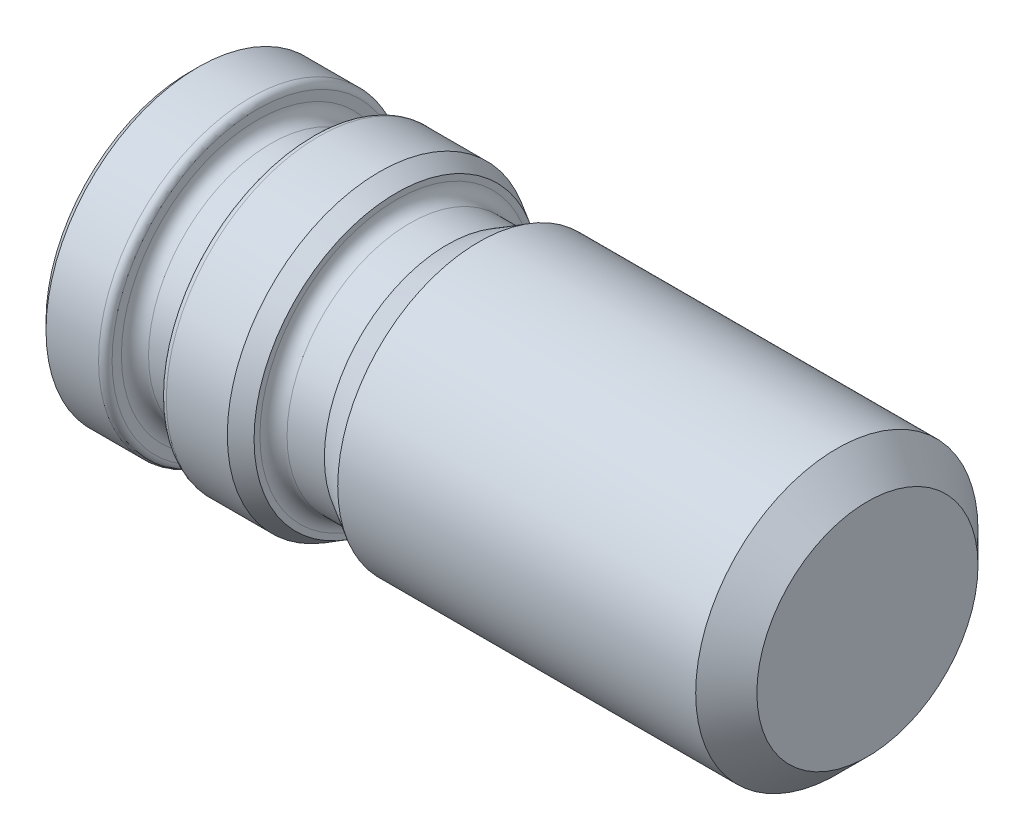
ISO-10303-21;
HEADER;
FILE_DESCRIPTION(('STEP AP214'),'2;1');
FILE_NAME('part.step','',(''),(''),'','','');
FILE_SCHEMA(('AUTOMOTIVE_DESIGN { 1 0 10303 214 1 1 1 1 }'));
ENDSEC;
DATA;
#1=APPLICATION_CONTEXT('core data for automotive mechanical design processes');
#2=APPLICATION_PROTOCOL_DEFINITION('international standard','automotive_design',2000,#1);
#3=PRODUCT_CONTEXT('',#1,'mechanical');
#4=PRODUCT('Part','Part','',(#3));
#5=PRODUCT_RELATED_PRODUCT_CATEGORY('part','',(#4));
#6=PRODUCT_DEFINITION_FORMATION('','',#4);
#7=PRODUCT_DEFINITION_CONTEXT('part definition',#1,'design');
#8=PRODUCT_DEFINITION('design','',#6,#7);
#9=PRODUCT_DEFINITION_SHAPE('','',#8);
#10=(LENGTH_UNIT() NAMED_UNIT(*) SI_UNIT(.MILLI.,.METRE.));
#11=(NAMED_UNIT(*) PLANE_ANGLE_UNIT() SI_UNIT($,.RADIAN.));
#12=(NAMED_UNIT(*) SI_UNIT($,.STERADIAN.) SOLID_ANGLE_UNIT());
#13=UNCERTAINTY_MEASURE_WITH_UNIT(LENGTH_MEASURE(1.E-05),#10,'distance_accuracy_value','');
#14=(GEOMETRIC_REPRESENTATION_CONTEXT(3) GLOBAL_UNCERTAINTY_ASSIGNED_CONTEXT((#13)) GLOBAL_UNIT_ASSIGNED_CONTEXT((#10,
#11,#12)) REPRESENTATION_CONTEXT('',''));
#15=CARTESIAN_POINT('',(0.,0.,0.));
#16=DIRECTION('',(0.,0.,1.));
#17=DIRECTION('',(1.,0.,0.));
#18=AXIS2_PLACEMENT_3D('',#15,#16,#17);
#19=CARTESIAN_POINT('',(-40.,8.975,0.));
#20=DIRECTION('',(1.,0.,0.));
#21=DIRECTION('',(0.,0.,-1.));
#22=AXIS2_PLACEMENT_3D('',#19,#20,#21);
#23=PLANE('',#22);
#24=CARTESIAN_POINT('',(-40.,0.,0.));
#25=DIRECTION('',(1.,0.,0.));
#26=DIRECTION('',(0.,0.,-1.));
#27=AXIS2_PLACEMENT_3D('',#24,#25,#26);
#28=CIRCLE('',#27,8.475);
#29=CARTESIAN_POINT('',(-40.,0.,-8.475));
#30=VERTEX_POINT('',#29);
#31=EDGE_CURVE('E229',#30,#30,#28,.F.);
#32=ORIENTED_EDGE('',*,*,#31,.T.);
#33=EDGE_LOOP('',(#32));
#34=FACE_BOUND('',#33,.T.);
#35=DIRECTION('',(0.,0.866025403784438,-0.5));
#36=VECTOR('',#35,1.);
#37=CARTESIAN_POINT('',(-40.,4.43124999999999,-7.87000585689109));
#38=LINE('',#37,#36);
#39=CARTESIAN_POINT('',(-40.,-4.6,-2.65581123827228));
#40=VERTEX_POINT('',#39);
#41=CARTESIAN_POINT('',(-40.,0.,-5.31162247654456));
#42=VERTEX_POINT('',#41);
#43=EDGE_CURVE('E216',#40,#42,#38,.T.);
#44=ORIENTED_EDGE('',*,*,#43,.T.);
#45=DIRECTION('',(0.,0.866025403784439,0.5));
#46=VECTOR('',#45,1.);
#47=CARTESIAN_POINT('',(-40.,9.03125,-0.097427857925748));
#48=LINE('',#47,#46);
#49=CARTESIAN_POINT('',(-40.,4.6,-2.65581123827228));
#50=VERTEX_POINT('',#49);
#51=EDGE_CURVE('E218',#42,#50,#48,.T.);
#52=ORIENTED_EDGE('',*,*,#51,.T.);
#53=DIRECTION('',(0.,0.,1.));
#54=VECTOR('',#53,1.);
#55=CARTESIAN_POINT('',(-40.,4.6,0.));
#56=LINE('',#55,#54);
#57=CARTESIAN_POINT('',(-40.,4.6,2.65581123827228));
#58=VERTEX_POINT('',#57);
#59=EDGE_CURVE('E208',#50,#58,#56,.T.);
#60=ORIENTED_EDGE('',*,*,#59,.T.);
#61=DIRECTION('',(0.,-0.866025403784439,0.5));
#62=VECTOR('',#61,1.);
#63=CARTESIAN_POINT('',(-40.,9.03125,0.0974278579257476));
#64=LINE('',#63,#62);
#65=CARTESIAN_POINT('',(-40.,0.,5.31162247654456));
#66=VERTEX_POINT('',#65);
#67=EDGE_CURVE('E210',#58,#66,#64,.T.);
#68=ORIENTED_EDGE('',*,*,#67,.T.);
#69=DIRECTION('',(0.,-0.866025403784439,-0.5));
#70=VECTOR('',#69,1.);
#71=CARTESIAN_POINT('',(-40.,4.43125,7.87000585689109));
#72=LINE('',#71,#70);
#73=CARTESIAN_POINT('',(-40.,-4.6,2.65581123827228));
#74=VERTEX_POINT('',#73);
#75=EDGE_CURVE('E212',#66,#74,#72,.T.);
#76=ORIENTED_EDGE('',*,*,#75,.T.);
#77=DIRECTION('',(0.,0.,-1.));
#78=VECTOR('',#77,1.);
#79=CARTESIAN_POINT('',(-40.,-4.6,0.));
#80=LINE('',#79,#78);
#81=EDGE_CURVE('E214',#74,#40,#80,.T.);
#82=ORIENTED_EDGE('',*,*,#81,.T.);
#83=EDGE_LOOP('',(#44,#52,#60,#68,#76,#82));
#84=FACE_BOUND('',#83,.T.);
#85=ADVANCED_FACE('F46',(#34,#84),#23,.F.);
#86=CARTESIAN_POINT('',(0.,0.,0.));
#87=DIRECTION('',(-1.,0.,0.));
#88=DIRECTION('',(0.,0.,1.));
#89=AXIS2_PLACEMENT_3D('',#86,#87,#88);
#90=CYLINDRICAL_SURFACE('',#89,8.975);
#91=CARTESIAN_POINT('',(-39.5,0.,0.));
#92=DIRECTION('',(1.,0.,0.));
#93=DIRECTION('',(0.,0.,-1.));
#94=AXIS2_PLACEMENT_3D('',#91,#92,#93);
#95=CIRCLE('',#94,8.975);
#96=CARTESIAN_POINT('',(-39.5,0.,-8.975));
#97=VERTEX_POINT('',#96);
#98=EDGE_CURVE('E244',#97,#97,#95,.T.);
#99=ORIENTED_EDGE('',*,*,#98,.T.);
#100=EDGE_LOOP('',(#99));
#101=FACE_BOUND('',#100,.T.);
#102=CARTESIAN_POINT('',(-36.4,0.,0.));
#103=DIRECTION('',(-1.,0.,0.));
#104=DIRECTION('',(0.,0.,1.));
#105=AXIS2_PLACEMENT_3D('',#102,#103,#104);
#106=CIRCLE('',#105,8.975);
#107=CARTESIAN_POINT('',(-36.4,0.,8.975));
#108=VERTEX_POINT('',#107);
#109=EDGE_CURVE('E202',#108,#108,#106,.T.);
#110=ORIENTED_EDGE('',*,*,#109,.T.);
#111=EDGE_LOOP('',(#110));
#112=FACE_BOUND('',#111,.T.);
#113=ADVANCED_FACE('F263',(#101,#112),#90,.T.);
#114=CARTESIAN_POINT('',(-36.4,0.,0.));
#115=DIRECTION('',(-1.,0.,0.));
#116=DIRECTION('',(0.,0.,1.));
#117=AXIS2_PLACEMENT_3D('',#114,#115,#116);
#118=TOROIDAL_SURFACE('',#117,8.575,0.399999999999998);
#119=ORIENTED_EDGE('',*,*,#109,.F.);
#120=EDGE_LOOP('',(#119));
#121=FACE_BOUND('',#120,.T.);
#122=CARTESIAN_POINT('',(-36.,0.,0.));
#123=DIRECTION('',(-1.,0.,0.));
#124=DIRECTION('',(0.,0.,1.));
#125=AXIS2_PLACEMENT_3D('',#122,#123,#124);
#126=CIRCLE('',#125,8.575);
#127=CARTESIAN_POINT('',(-36.,0.,8.575));
#128=VERTEX_POINT('',#127);
#129=EDGE_CURVE('E199',#128,#128,#126,.T.);
#130=ORIENTED_EDGE('',*,*,#129,.T.);
#131=EDGE_LOOP('',(#130));
#132=FACE_BOUND('',#131,.T.);
#133=ADVANCED_FACE('F270',(#121,#132),#118,.T.);
#134=CARTESIAN_POINT('',(-36.,8.025,0.));
#135=DIRECTION('',(-1.,0.,0.));
#136=DIRECTION('',(0.,0.,1.));
#137=AXIS2_PLACEMENT_3D('',#134,#135,#136);
#138=PLANE('',#137);
#139=ORIENTED_EDGE('',*,*,#129,.F.);
#140=EDGE_LOOP('',(#139));
#141=FACE_BOUND('',#140,.T.);
#142=CARTESIAN_POINT('',(-36.,0.,0.));
#143=DIRECTION('',(-1.,0.,0.));
#144=DIRECTION('',(0.,0.,1.));
#145=AXIS2_PLACEMENT_3D('',#142,#143,#144);
#146=CIRCLE('',#145,8.025);
#147=CARTESIAN_POINT('',(-36.,0.,8.025));
#148=VERTEX_POINT('',#147);
#149=EDGE_CURVE('E196',#148,#148,#146,.T.);
#150=ORIENTED_EDGE('',*,*,#149,.T.);
#151=EDGE_LOOP('',(#150));
#152=FACE_BOUND('',#151,.T.);
#153=ADVANCED_FACE('F387',(#141,#152),#138,.F.);
#154=CARTESIAN_POINT('',(-35.2,0.,0.));
#155=DIRECTION('',(-1.,0.,0.));
#156=DIRECTION('',(0.,0.,1.));
#157=AXIS2_PLACEMENT_3D('',#154,#155,#156);
#158=TOROIDAL_SURFACE('',#157,8.025,0.800000000000001);
#159=ORIENTED_EDGE('',*,*,#149,.F.);
#160=EDGE_LOOP('',(#159));
#161=FACE_BOUND('',#160,.T.);
#162=CARTESIAN_POINT('',(-35.2,0.,0.));
#163=DIRECTION('',(-1.,0.,0.));
#164=DIRECTION('',(0.,0.,1.));
#165=AXIS2_PLACEMENT_3D('',#162,#163,#164);
#166=CIRCLE('',#165,7.225);
#167=CARTESIAN_POINT('',(-35.2,0.,7.225));
#168=VERTEX_POINT('',#167);
#169=EDGE_CURVE('E193',#168,#168,#166,.T.);
#170=ORIENTED_EDGE('',*,*,#169,.T.);
#171=EDGE_LOOP('',(#170));
#172=FACE_BOUND('',#171,.T.);
#173=ADVANCED_FACE('F383',(#161,#172),#158,.F.);
#174=CARTESIAN_POINT('',(0.,0.,0.));
#175=DIRECTION('',(-1.,0.,0.));
#176=DIRECTION('',(0.,0.,1.));
#177=AXIS2_PLACEMENT_3D('',#174,#175,#176);
#178=CYLINDRICAL_SURFACE('',#177,7.225);
#179=ORIENTED_EDGE('',*,*,#169,.F.);
#180=EDGE_LOOP('',(#179));
#181=FACE_BOUND('',#180,.T.);
#182=CARTESIAN_POINT('',(-33.6,0.,0.));
#183=DIRECTION('',(-1.,0.,0.));
#184=DIRECTION('',(0.,0.,1.));
#185=AXIS2_PLACEMENT_3D('',#182,#183,#184);
#186=CIRCLE('',#185,7.225);
#187=CARTESIAN_POINT('',(-33.6,0.,7.225));
#188=VERTEX_POINT('',#187);
#189=EDGE_CURVE('E190',#188,#188,#186,.T.);
#190=ORIENTED_EDGE('',*,*,#189,.T.);
#191=EDGE_LOOP('',(#190));
#192=FACE_BOUND('',#191,.T.);
#193=ADVANCED_FACE('F379',(#181,#192),#178,.T.);
#194=CARTESIAN_POINT('',(-33.6,0.,0.));
#195=DIRECTION('',(-1.,0.,0.));
#196=DIRECTION('',(0.,0.,1.));
#197=AXIS2_PLACEMENT_3D('',#194,#195,#196);
#198=TOROIDAL_SURFACE('',#197,8.025,0.799999999999997);
#199=ORIENTED_EDGE('',*,*,#189,.F.);
#200=EDGE_LOOP('',(#199));
#201=FACE_BOUND('',#200,.T.);
#202=CARTESIAN_POINT('',(-32.8,0.,0.));
#203=DIRECTION('',(-1.,0.,0.));
#204=DIRECTION('',(0.,0.,1.));
#205=AXIS2_PLACEMENT_3D('',#202,#203,#204);
#206=CIRCLE('',#205,8.025);
#207=CARTESIAN_POINT('',(-32.8,0.,8.025));
#208=VERTEX_POINT('',#207);
#209=EDGE_CURVE('E187',#208,#208,#206,.T.);
#210=ORIENTED_EDGE('',*,*,#209,.T.);
#211=EDGE_LOOP('',(#210));
#212=FACE_BOUND('',#211,.T.);
#213=ADVANCED_FACE('F375',(#201,#212),#198,.F.);
#214=CARTESIAN_POINT('',(-32.8,8.575,0.));
#215=DIRECTION('',(1.,0.,0.));
#216=DIRECTION('',(0.,0.,-1.));
#217=AXIS2_PLACEMENT_3D('',#214,#215,#216);
#218=PLANE('',#217);
#219=ORIENTED_EDGE('',*,*,#209,.F.);
#220=EDGE_LOOP('',(#219));
#221=FACE_BOUND('',#220,.T.);
#222=CARTESIAN_POINT('',(-32.8,0.,0.));
#223=DIRECTION('',(-1.,0.,0.));
#224=DIRECTION('',(0.,0.,1.));
#225=AXIS2_PLACEMENT_3D('',#222,#223,#224);
#226=CIRCLE('',#225,8.575);
#227=CARTESIAN_POINT('',(-32.8,0.,8.575));
#228=VERTEX_POINT('',#227);
#229=EDGE_CURVE('E184',#228,#228,#226,.T.);
#230=ORIENTED_EDGE('',*,*,#229,.T.);
#231=EDGE_LOOP('',(#230));
#232=FACE_BOUND('',#231,.T.);
#233=ADVANCED_FACE('F371',(#221,#232),#218,.F.);
#234=CARTESIAN_POINT('',(-32.4,0.,0.));
#235=DIRECTION('',(-1.,0.,0.));
#236=DIRECTION('',(0.,0.,1.));
#237=AXIS2_PLACEMENT_3D('',#234,#235,#236);
#238=TOROIDAL_SURFACE('',#237,8.575,0.399999999999995);
#239=ORIENTED_EDGE('',*,*,#229,.F.);
#240=EDGE_LOOP('',(#239));
#241=FACE_BOUND('',#240,.T.);
#242=CARTESIAN_POINT('',(-32.4,0.,0.));
#243=DIRECTION('',(-1.,0.,0.));
#244=DIRECTION('',(0.,0.,1.));
#245=AXIS2_PLACEMENT_3D('',#242,#243,#244);
#246=CIRCLE('',#245,8.975);
#247=CARTESIAN_POINT('',(-32.4,0.,8.975));
#248=VERTEX_POINT('',#247);
#249=EDGE_CURVE('E181',#248,#248,#246,.T.);
#250=ORIENTED_EDGE('',*,*,#249,.T.);
#251=EDGE_LOOP('',(#250));
#252=FACE_BOUND('',#251,.T.);
#253=ADVANCED_FACE('F368',(#241,#252),#238,.T.);
#254=CARTESIAN_POINT('',(0.,0.,0.));
#255=DIRECTION('',(-1.,0.,0.));
#256=DIRECTION('',(0.,0.,1.));
#257=AXIS2_PLACEMENT_3D('',#254,#255,#256);
#258=CYLINDRICAL_SURFACE('',#257,8.975);
#259=CARTESIAN_POINT('',(-28.8,0.,0.));
#260=DIRECTION('',(-1.,0.,0.));
#261=DIRECTION('',(0.,0.,1.));
#262=AXIS2_PLACEMENT_3D('',#259,#260,#261);
#263=CIRCLE('',#262,8.975);
#264=CARTESIAN_POINT('',(-28.8,0.,8.975));
#265=VERTEX_POINT('',#264);
#266=EDGE_CURVE('E54',#265,#265,#263,.T.);
#267=ORIENTED_EDGE('',*,*,#266,.T.);
#268=EDGE_LOOP('',(#267));
#269=FACE_BOUND('',#268,.T.);
#270=ORIENTED_EDGE('',*,*,#249,.F.);
#271=EDGE_LOOP('',(#270));
#272=FACE_BOUND('',#271,.T.);
#273=ADVANCED_FACE('F249',(#269,#272),#258,.T.);
#274=CARTESIAN_POINT('',(-27.8,8.05,0.));
#275=DIRECTION('',(-1.,0.,0.));
#276=DIRECTION('',(0.,0.,1.));
#277=AXIS2_PLACEMENT_3D('',#274,#275,#276);
#278=PLANE('',#277);
#279=CARTESIAN_POINT('',(-27.8,0.,0.));
#280=DIRECTION('',(-1.,0.,0.));
#281=DIRECTION('',(0.,0.,1.));
#282=AXIS2_PLACEMENT_3D('',#279,#280,#281);
#283=CIRCLE('',#282,8.39764973081037);
#284=CARTESIAN_POINT('',(-27.8,0.,8.39764973081037));
#285=VERTEX_POINT('',#284);
#286=EDGE_CURVE('E11',#285,#285,#283,.F.);
#287=ORIENTED_EDGE('',*,*,#286,.T.);
#288=EDGE_LOOP('',(#287));
#289=FACE_BOUND('',#288,.T.);
#290=CARTESIAN_POINT('',(-27.8,0.,0.));
#291=DIRECTION('',(-1.,0.,0.));
#292=DIRECTION('',(0.,0.,1.));
#293=AXIS2_PLACEMENT_3D('',#290,#291,#292);
#294=CIRCLE('',#293,8.05);
#295=CARTESIAN_POINT('',(-27.8,0.,8.05));
#296=VERTEX_POINT('',#295);
#297=EDGE_CURVE('E178',#296,#296,#294,.T.);
#298=ORIENTED_EDGE('',*,*,#297,.T.);
#299=EDGE_LOOP('',(#298));
#300=FACE_BOUND('',#299,.T.);
#301=ADVANCED_FACE('F362',(#289,#300),#278,.F.);
#302=CARTESIAN_POINT('',(-27.,0.,0.));
#303=DIRECTION('',(-1.,0.,0.));
#304=DIRECTION('',(0.,0.,1.));
#305=AXIS2_PLACEMENT_3D('',#302,#303,#304);
#306=TOROIDAL_SURFACE('',#305,8.05,0.799999999999997);
#307=ORIENTED_EDGE('',*,*,#297,.F.);
#308=EDGE_LOOP('',(#307));
#309=FACE_BOUND('',#308,.T.);
#310=CARTESIAN_POINT('',(-27.,0.,0.));
#311=DIRECTION('',(-1.,0.,0.));
#312=DIRECTION('',(0.,0.,1.));
#313=AXIS2_PLACEMENT_3D('',#310,#311,#312);
#314=CIRCLE('',#313,7.25);
#315=CARTESIAN_POINT('',(-27.,0.,7.25));
#316=VERTEX_POINT('',#315);
#317=EDGE_CURVE('E175',#316,#316,#314,.T.);
#318=ORIENTED_EDGE('',*,*,#317,.T.);
#319=EDGE_LOOP('',(#318));
#320=FACE_BOUND('',#319,.T.);
#321=ADVANCED_FACE('F358',(#309,#320),#306,.F.);
#322=CARTESIAN_POINT('',(0.,0.,0.));
#323=DIRECTION('',(-1.,0.,0.));
#324=DIRECTION('',(0.,0.,1.));
#325=AXIS2_PLACEMENT_3D('',#322,#323,#324);
#326=CYLINDRICAL_SURFACE('',#325,7.25);
#327=ORIENTED_EDGE('',*,*,#317,.F.);
#328=EDGE_LOOP('',(#327));
#329=FACE_BOUND('',#328,.T.);
#330=CARTESIAN_POINT('',(-24.8,0.,0.));
#331=DIRECTION('',(-1.,0.,0.));
#332=DIRECTION('',(0.,0.,1.));
#333=AXIS2_PLACEMENT_3D('',#330,#331,#332);
#334=CIRCLE('',#333,7.25);
#335=CARTESIAN_POINT('',(-24.8,0.,7.25));
#336=VERTEX_POINT('',#335);
#337=EDGE_CURVE('E172',#336,#336,#334,.T.);
#338=ORIENTED_EDGE('',*,*,#337,.T.);
#339=EDGE_LOOP('',(#338));
#340=FACE_BOUND('',#339,.T.);
#341=ADVANCED_FACE('F354',(#329,#340),#326,.T.);
#342=CARTESIAN_POINT('',(-22.9293851278256,0.,0.));
#343=DIRECTION('',(1.,0.,0.));
#344=DIRECTION('',(0.,0.,-1.));
#345=AXIS2_PLACEMENT_3D('',#342,#343,#344);
#346=CONICAL_SURFACE('',#345,8.33,0.523598775598301);
#347=ORIENTED_EDGE('',*,*,#337,.F.);
#348=EDGE_LOOP('',(#347));
#349=FACE_BOUND('',#348,.T.);
#350=CARTESIAN_POINT('',(-22.9293851278256,0.,0.));
#351=DIRECTION('',(-1.,0.,0.));
#352=DIRECTION('',(0.,0.,1.));
#353=AXIS2_PLACEMENT_3D('',#350,#351,#352);
#354=CIRCLE('',#353,8.33);
#355=CARTESIAN_POINT('',(-22.9293851278256,0.,8.33));
#356=VERTEX_POINT('',#355);
#357=EDGE_CURVE('E169',#356,#356,#354,.T.);
#358=ORIENTED_EDGE('',*,*,#357,.T.);
#359=EDGE_LOOP('',(#358));
#360=FACE_BOUND('',#359,.T.);
#361=ADVANCED_FACE('F350',(#349,#360),#346,.T.);
#362=CARTESIAN_POINT('',(0.,0.,0.));
#363=DIRECTION('',(-1.,0.,0.));
#364=DIRECTION('',(0.,0.,1.));
#365=AXIS2_PLACEMENT_3D('',#362,#363,#364);
#366=CYLINDRICAL_SURFACE('',#365,8.33);
#367=ORIENTED_EDGE('',*,*,#357,.F.);
#368=EDGE_LOOP('',(#367));
#369=FACE_BOUND('',#368,.T.);
#370=CARTESIAN_POINT('',(-1.80499999999999,0.,0.));
#371=DIRECTION('',(-1.,0.,0.));
#372=DIRECTION('',(0.,0.,1.));
#373=AXIS2_PLACEMENT_3D('',#370,#371,#372);
#374=CIRCLE('',#373,8.33);
#375=CARTESIAN_POINT('',(-1.80499999999999,0.,8.33));
#376=VERTEX_POINT('',#375);
#377=EDGE_CURVE('E166',#376,#376,#374,.T.);
#378=ORIENTED_EDGE('',*,*,#377,.T.);
#379=EDGE_LOOP('',(#378));
#380=FACE_BOUND('',#379,.T.);
#381=ADVANCED_FACE('F346',(#369,#380),#366,.T.);
#382=CARTESIAN_POINT('',(0.,0.,0.));
#383=DIRECTION('',(-1.,0.,0.));
#384=DIRECTION('',(0.,0.,1.));
#385=AXIS2_PLACEMENT_3D('',#382,#383,#384);
#386=CONICAL_SURFACE('',#385,6.525,0.78539816339745);
#387=ORIENTED_EDGE('',*,*,#377,.F.);
#388=EDGE_LOOP('',(#387));
#389=FACE_BOUND('',#388,.T.);
#390=CARTESIAN_POINT('',(0.,0.,0.));
#391=DIRECTION('',(-1.,0.,0.));
#392=DIRECTION('',(0.,0.,1.));
#393=AXIS2_PLACEMENT_3D('',#390,#391,#392);
#394=CIRCLE('',#393,6.525);
#395=CARTESIAN_POINT('',(0.,0.,6.525));
#396=VERTEX_POINT('',#395);
#397=EDGE_CURVE('E154',#396,#396,#394,.T.);
#398=ORIENTED_EDGE('',*,*,#397,.T.);
#399=EDGE_LOOP('',(#398));
#400=FACE_BOUND('',#399,.T.);
#401=ADVANCED_FACE('F342',(#389,#400),#386,.T.);
#402=CARTESIAN_POINT('',(0.,0.,0.));
#403=DIRECTION('',(-1.,0.,0.));
#404=DIRECTION('',(0.,0.,1.));
#405=AXIS2_PLACEMENT_3D('',#402,#403,#404);
#406=PLANE('',#405);
#407=ORIENTED_EDGE('',*,*,#397,.F.);
#408=EDGE_LOOP('',(#407));
#409=FACE_BOUND('',#408,.T.);
#410=ADVANCED_FACE('F332',(#409),#406,.F.);
#411=CARTESIAN_POINT('',(-32.,0.,4.73427220735493));
#412=DIRECTION('',(0.,0.5,0.866025403784439));
#413=DIRECTION('',(0.,-0.866025403784439,0.5));
#414=AXIS2_PLACEMENT_3D('',#411,#412,#413);
#415=PLANE('',#414);
#416=DIRECTION('',(-1.,0.,0.));
#417=VECTOR('',#416,1.);
#418=CARTESIAN_POINT('',(-32.,0.,4.73427220735493));
#419=LINE('',#418,#417);
#420=CARTESIAN_POINT('',(-32.,0.,4.73427220735493));
#421=VERTEX_POINT('',#420);
#422=CARTESIAN_POINT('',(-39.5,0.,4.73427220735493));
#423=VERTEX_POINT('',#422);
#424=EDGE_CURVE('E152',#421,#423,#419,.T.);
#425=ORIENTED_EDGE('',*,*,#424,.T.);
#426=DIRECTION('',(0.,0.866025403784439,-0.5));
#427=VECTOR('',#426,1.);
#428=CARTESIAN_POINT('',(-39.5,0.,4.73427220735493));
#429=LINE('',#428,#427);
#430=CARTESIAN_POINT('',(-39.5,4.1,2.36713610367747));
#431=VERTEX_POINT('',#430);
#432=EDGE_CURVE('E61',#423,#431,#429,.T.);
#433=ORIENTED_EDGE('',*,*,#432,.T.);
#434=DIRECTION('',(-1.,0.,0.));
#435=VECTOR('',#434,1.);
#436=CARTESIAN_POINT('',(-32.,4.1,2.36713610367747));
#437=LINE('',#436,#435);
#438=CARTESIAN_POINT('',(-32.,4.1,2.36713610367747));
#439=VERTEX_POINT('',#438);
#440=EDGE_CURVE('E116',#439,#431,#437,.T.);
#441=ORIENTED_EDGE('',*,*,#440,.F.);
#442=DIRECTION('',(0.,0.866025403784439,-0.5));
#443=VECTOR('',#442,1.);
#444=CARTESIAN_POINT('',(-32.,0.,4.73427220735493));
#445=LINE('',#444,#443);
#446=EDGE_CURVE('E120',#421,#439,#445,.T.);
#447=ORIENTED_EDGE('',*,*,#446,.F.);
#448=EDGE_LOOP('',(#425,#433,#441,#447));
#449=FACE_BOUND('',#448,.T.);
#450=ADVANCED_FACE('F118',(#449),#415,.F.);
#451=CARTESIAN_POINT('',(-32.,-4.1,2.36713610367746));
#452=DIRECTION('',(0.,-0.5,0.866025403784439));
#453=DIRECTION('',(0.,-0.866025403784439,-0.5));
#454=AXIS2_PLACEMENT_3D('',#451,#452,#453);
#455=PLANE('',#454);
#456=DIRECTION('',(-1.,0.,0.));
#457=VECTOR('',#456,1.);
#458=CARTESIAN_POINT('',(-32.,-4.1,2.36713610367746));
#459=LINE('',#458,#457);
#460=CARTESIAN_POINT('',(-32.,-4.1,2.36713610367746));
#461=VERTEX_POINT('',#460);
#462=CARTESIAN_POINT('',(-39.5,-4.1,2.36713610367746));
#463=VERTEX_POINT('',#462);
#464=EDGE_CURVE('E155',#461,#463,#459,.T.);
#465=ORIENTED_EDGE('',*,*,#464,.T.);
#466=DIRECTION('',(0.,0.866025403784439,0.5));
#467=VECTOR('',#466,1.);
#468=CARTESIAN_POINT('',(-39.5,-4.1,2.36713610367746));
#469=LINE('',#468,#467);
#470=EDGE_CURVE('E69',#463,#423,#469,.T.);
#471=ORIENTED_EDGE('',*,*,#470,.T.);
#472=ORIENTED_EDGE('',*,*,#424,.F.);
#473=DIRECTION('',(0.,0.866025403784439,0.5));
#474=VECTOR('',#473,1.);
#475=CARTESIAN_POINT('',(-32.,-4.1,2.36713610367746));
#476=LINE('',#475,#474);
#477=EDGE_CURVE('E125',#461,#421,#476,.T.);
#478=ORIENTED_EDGE('',*,*,#477,.F.);
#479=EDGE_LOOP('',(#465,#471,#472,#478));
#480=FACE_BOUND('',#479,.T.);
#481=ADVANCED_FACE('F324',(#480),#455,.F.);
#482=CARTESIAN_POINT('',(-32.,-4.1,-2.36713610367746));
#483=DIRECTION('',(0.,-1.,0.));
#484=DIRECTION('',(0.,0.,-1.));
#485=AXIS2_PLACEMENT_3D('',#482,#483,#484);
#486=PLANE('',#485);
#487=DIRECTION('',(-1.,0.,0.));
#488=VECTOR('',#487,1.);
#489=CARTESIAN_POINT('',(-32.,-4.1,-2.36713610367746));
#490=LINE('',#489,#488);
#491=CARTESIAN_POINT('',(-32.,-4.1,-2.36713610367746));
#492=VERTEX_POINT('',#491);
#493=CARTESIAN_POINT('',(-39.5,-4.1,-2.36713610367746));
#494=VERTEX_POINT('',#493);
#495=EDGE_CURVE('E157',#492,#494,#490,.T.);
#496=ORIENTED_EDGE('',*,*,#495,.T.);
#497=DIRECTION('',(0.,0.,1.));
#498=VECTOR('',#497,1.);
#499=CARTESIAN_POINT('',(-39.5,-4.1,-2.36713610367746));
#500=LINE('',#499,#498);
#501=EDGE_CURVE('E223',#494,#463,#500,.T.);
#502=ORIENTED_EDGE('',*,*,#501,.T.);
#503=ORIENTED_EDGE('',*,*,#464,.F.);
#504=DIRECTION('',(0.,0.,1.));
#505=VECTOR('',#504,1.);
#506=CARTESIAN_POINT('',(-32.,-4.1,-2.36713610367746));
#507=LINE('',#506,#505);
#508=EDGE_CURVE('E149',#492,#461,#507,.T.);
#509=ORIENTED_EDGE('',*,*,#508,.F.);
#510=EDGE_LOOP('',(#496,#502,#503,#509));
#511=FACE_BOUND('',#510,.T.);
#512=ADVANCED_FACE('F323',(#511),#486,.F.);
#513=CARTESIAN_POINT('',(-32.,0.,-4.73427220735493));
#514=DIRECTION('',(0.,-0.5,-0.866025403784439));
#515=DIRECTION('',(0.,0.866025403784438,-0.5));
#516=AXIS2_PLACEMENT_3D('',#513,#514,#515);
#517=PLANE('',#516);
#518=DIRECTION('',(-1.,0.,0.));
#519=VECTOR('',#518,1.);
#520=CARTESIAN_POINT('',(-32.,0.,-4.73427220735493));
#521=LINE('',#520,#519);
#522=CARTESIAN_POINT('',(-32.,0.,-4.73427220735493));
#523=VERTEX_POINT('',#522);
#524=CARTESIAN_POINT('',(-39.5,0.,-4.73427220735493));
#525=VERTEX_POINT('',#524);
#526=EDGE_CURVE('E160',#523,#525,#521,.T.);
#527=ORIENTED_EDGE('',*,*,#526,.T.);
#528=DIRECTION('',(0.,-0.866025403784438,0.5));
#529=VECTOR('',#528,1.);
#530=CARTESIAN_POINT('',(-39.5,0.,-4.73427220735493));
#531=LINE('',#530,#529);
#532=EDGE_CURVE('E221',#525,#494,#531,.T.);
#533=ORIENTED_EDGE('',*,*,#532,.T.);
#534=ORIENTED_EDGE('',*,*,#495,.F.);
#535=DIRECTION('',(0.,-0.866025403784438,0.5));
#536=VECTOR('',#535,1.);
#537=CARTESIAN_POINT('',(-32.,0.,-4.73427220735493));
#538=LINE('',#537,#536);
#539=EDGE_CURVE('E146',#523,#492,#538,.T.);
#540=ORIENTED_EDGE('',*,*,#539,.F.);
#541=EDGE_LOOP('',(#527,#533,#534,#540));
#542=FACE_BOUND('',#541,.T.);
#543=ADVANCED_FACE('F320',(#542),#517,.F.);
#544=CARTESIAN_POINT('',(-32.,4.1,-2.36713610367747));
#545=DIRECTION('',(0.,0.5,-0.866025403784439));
#546=DIRECTION('',(0.,0.866025403784439,0.5));
#547=AXIS2_PLACEMENT_3D('',#544,#545,#546);
#548=PLANE('',#547);
#549=DIRECTION('',(-1.,0.,0.));
#550=VECTOR('',#549,1.);
#551=CARTESIAN_POINT('',(-32.,4.1,-2.36713610367747));
#552=LINE('',#551,#550);
#553=CARTESIAN_POINT('',(-32.,4.1,-2.36713610367747));
#554=VERTEX_POINT('',#553);
#555=CARTESIAN_POINT('',(-39.5,4.1,-2.36713610367747));
#556=VERTEX_POINT('',#555);
#557=EDGE_CURVE('E124',#554,#556,#552,.T.);
#558=ORIENTED_EDGE('',*,*,#557,.T.);
#559=DIRECTION('',(0.,-0.866025403784439,-0.5));
#560=VECTOR('',#559,1.);
#561=CARTESIAN_POINT('',(-39.5,4.1,-2.36713610367747));
#562=LINE('',#561,#560);
#563=EDGE_CURVE('E205',#556,#525,#562,.T.);
#564=ORIENTED_EDGE('',*,*,#563,.T.);
#565=ORIENTED_EDGE('',*,*,#526,.F.);
#566=DIRECTION('',(0.,-0.866025403784439,-0.5));
#567=VECTOR('',#566,1.);
#568=CARTESIAN_POINT('',(-32.,4.1,-2.36713610367747));
#569=LINE('',#568,#567);
#570=EDGE_CURVE('E134',#554,#523,#569,.T.);
#571=ORIENTED_EDGE('',*,*,#570,.F.);
#572=EDGE_LOOP('',(#558,#564,#565,#571));
#573=FACE_BOUND('',#572,.T.);
#574=ADVANCED_FACE('F316',(#573),#548,.F.);
#575=CARTESIAN_POINT('',(-32.,4.1,2.36713610367747));
#576=DIRECTION('',(0.,1.,0.));
#577=DIRECTION('',(0.,0.,1.));
#578=AXIS2_PLACEMENT_3D('',#575,#576,#577);
#579=PLANE('',#578);
#580=ORIENTED_EDGE('',*,*,#440,.T.);
#581=DIRECTION('',(0.,0.,-1.));
#582=VECTOR('',#581,1.);
#583=CARTESIAN_POINT('',(-39.5,4.1,2.36713610367747));
#584=LINE('',#583,#582);
#585=EDGE_CURVE('E227',#431,#556,#584,.T.);
#586=ORIENTED_EDGE('',*,*,#585,.T.);
#587=ORIENTED_EDGE('',*,*,#557,.F.);
#588=DIRECTION('',(0.,0.,-1.));
#589=VECTOR('',#588,1.);
#590=CARTESIAN_POINT('',(-32.,4.1,2.36713610367747));
#591=LINE('',#590,#589);
#592=EDGE_CURVE('E128',#439,#554,#591,.T.);
#593=ORIENTED_EDGE('',*,*,#592,.F.);
#594=EDGE_LOOP('',(#580,#586,#587,#593));
#595=FACE_BOUND('',#594,.T.);
#596=ADVANCED_FACE('F129',(#595),#579,.F.);
#597=CARTESIAN_POINT('',(-32.,8.2,0.));
#598=DIRECTION('',(-1.,0.,0.));
#599=DIRECTION('',(0.,0.,1.));
#600=AXIS2_PLACEMENT_3D('',#597,#598,#599);
#601=PLANE('',#600);
#602=ORIENTED_EDGE('',*,*,#446,.T.);
#603=ORIENTED_EDGE('',*,*,#592,.T.);
#604=ORIENTED_EDGE('',*,*,#570,.T.);
#605=ORIENTED_EDGE('',*,*,#539,.T.);
#606=ORIENTED_EDGE('',*,*,#508,.T.);
#607=ORIENTED_EDGE('',*,*,#477,.T.);
#608=EDGE_LOOP('',(#602,#603,#604,#605,#606,#607));
#609=FACE_BOUND('',#608,.T.);
#610=ADVANCED_FACE('F136',(#609),#601,.T.);
#611=CARTESIAN_POINT('',(-39.5,-4.1,2.36713610367746));
#612=DIRECTION('',(0.707106781186547,-0.353553390593274,0.612372435695794));
#613=DIRECTION('',(0.654653670707977,0.,-0.755928946018454));
#614=AXIS2_PLACEMENT_3D('',#611,#612,#613);
#615=PLANE('',#614);
#616=DIRECTION('',(-0.654653670707977,-0.654653670707978,0.377964473009226));
#617=VECTOR('',#616,1.);
#618=CARTESIAN_POINT('',(-38.3285714285714,-2.92857142857143,1.69081150262676));
#619=LINE('',#618,#617);
#620=EDGE_CURVE('E142',#74,#463,#619,.F.);
#621=ORIENTED_EDGE('',*,*,#620,.F.);
#622=ORIENTED_EDGE('',*,*,#75,.F.);
#623=DIRECTION('',(-0.654653670707978,0.,0.755928946018454));
#624=VECTOR('',#623,1.);
#625=CARTESIAN_POINT('',(-38.3285714285714,0.,3.38162300525353));
#626=LINE('',#625,#624);
#627=EDGE_CURVE('E139',#423,#66,#626,.T.);
#628=ORIENTED_EDGE('',*,*,#627,.F.);
#629=ORIENTED_EDGE('',*,*,#470,.F.);
#630=EDGE_LOOP('',(#621,#622,#628,#629));
#631=FACE_BOUND('',#630,.T.);
#632=ADVANCED_FACE('F293',(#631),#615,.F.);
#633=CARTESIAN_POINT('',(-39.5,0.,4.73427220735493));
#634=DIRECTION('',(0.707106781186547,0.353553390593274,0.612372435695795));
#635=DIRECTION('',(0.654653670707978,0.,-0.755928946018454));
#636=AXIS2_PLACEMENT_3D('',#633,#634,#635);
#637=PLANE('',#636);
#638=ORIENTED_EDGE('',*,*,#627,.T.);
#639=ORIENTED_EDGE('',*,*,#67,.F.);
#640=DIRECTION('',(-0.654653670707977,0.654653670707977,0.377964473009226));
#641=VECTOR('',#640,1.);
#642=CARTESIAN_POINT('',(-38.3285714285714,2.92857142857143,1.69081150262676));
#643=LINE('',#642,#641);
#644=EDGE_CURVE('E237',#431,#58,#643,.T.);
#645=ORIENTED_EDGE('',*,*,#644,.F.);
#646=ORIENTED_EDGE('',*,*,#432,.F.);
#647=EDGE_LOOP('',(#638,#639,#645,#646));
#648=FACE_BOUND('',#647,.T.);
#649=ADVANCED_FACE('F289',(#648),#637,.F.);
#650=CARTESIAN_POINT('',(-39.5,-4.1,-2.36713610367746));
#651=DIRECTION('',(0.707106781186548,-0.707106781186547,0.));
#652=DIRECTION('',(0.707106781186547,0.707106781186548,0.));
#653=AXIS2_PLACEMENT_3D('',#650,#651,#652);
#654=PLANE('',#653);
#655=ORIENTED_EDGE('',*,*,#620,.T.);
#656=ORIENTED_EDGE('',*,*,#501,.F.);
#657=DIRECTION('',(-0.654653670707976,-0.654653670707977,-0.377964473009229));
#658=VECTOR('',#657,1.);
#659=CARTESIAN_POINT('',(-38.3285714285714,-2.92857142857143,-1.69081150262676));
#660=LINE('',#659,#658);
#661=EDGE_CURVE('E234',#40,#494,#660,.F.);
#662=ORIENTED_EDGE('',*,*,#661,.F.);
#663=ORIENTED_EDGE('',*,*,#81,.F.);
#664=EDGE_LOOP('',(#655,#656,#662,#663));
#665=FACE_BOUND('',#664,.T.);
#666=ADVANCED_FACE('F285',(#665),#654,.F.);
#667=CARTESIAN_POINT('',(-39.5,4.1,2.36713610367747));
#668=DIRECTION('',(0.707106781186547,0.707106781186547,0.));
#669=DIRECTION('',(-0.707106781186548,0.707106781186548,0.));
#670=AXIS2_PLACEMENT_3D('',#667,#668,#669);
#671=PLANE('',#670);
#672=ORIENTED_EDGE('',*,*,#644,.T.);
#673=ORIENTED_EDGE('',*,*,#59,.F.);
#674=DIRECTION('',(0.654653670707977,-0.654653670707977,0.377964473009227));
#675=VECTOR('',#674,1.);
#676=CARTESIAN_POINT('',(-39.5,4.1,-2.36713610367747));
#677=LINE('',#676,#675);
#678=EDGE_CURVE('E232',#556,#50,#677,.F.);
#679=ORIENTED_EDGE('',*,*,#678,.F.);
#680=ORIENTED_EDGE('',*,*,#585,.F.);
#681=EDGE_LOOP('',(#672,#673,#679,#680));
#682=FACE_BOUND('',#681,.T.);
#683=ADVANCED_FACE('F281',(#682),#671,.F.);
#684=CARTESIAN_POINT('',(-39.5,0.,-4.73427220735493));
#685=DIRECTION('',(0.707106781186549,-0.353553390593273,-0.612372435695793));
#686=DIRECTION('',(-0.654653670707975,0.,-0.755928946018456));
#687=AXIS2_PLACEMENT_3D('',#684,#685,#686);
#688=PLANE('',#687);
#689=ORIENTED_EDGE('',*,*,#661,.T.);
#690=ORIENTED_EDGE('',*,*,#532,.F.);
#691=DIRECTION('',(-0.654653670707976,0.,-0.755928946018455));
#692=VECTOR('',#691,1.);
#693=CARTESIAN_POINT('',(-38.3285714285714,0.,-3.38162300525351));
#694=LINE('',#693,#692);
#695=EDGE_CURVE('E230',#42,#525,#694,.F.);
#696=ORIENTED_EDGE('',*,*,#695,.F.);
#697=ORIENTED_EDGE('',*,*,#43,.F.);
#698=EDGE_LOOP('',(#689,#690,#696,#697));
#699=FACE_BOUND('',#698,.T.);
#700=ADVANCED_FACE('F277',(#699),#688,.F.);
#701=CARTESIAN_POINT('',(-39.5,4.1,-2.36713610367747));
#702=DIRECTION('',(0.707106781186547,0.353553390593274,-0.612372435695795));
#703=DIRECTION('',(-0.654653670707977,0.,-0.755928946018454));
#704=AXIS2_PLACEMENT_3D('',#701,#702,#703);
#705=PLANE('',#704);
#706=ORIENTED_EDGE('',*,*,#678,.T.);
#707=ORIENTED_EDGE('',*,*,#51,.F.);
#708=ORIENTED_EDGE('',*,*,#695,.T.);
#709=ORIENTED_EDGE('',*,*,#563,.F.);
#710=EDGE_LOOP('',(#706,#707,#708,#709));
#711=FACE_BOUND('',#710,.T.);
#712=ADVANCED_FACE('F259',(#711),#705,.F.);
#713=CARTESIAN_POINT('',(-40.,0.,0.));
#714=DIRECTION('',(1.,0.,0.));
#715=DIRECTION('',(0.,0.,-1.));
#716=AXIS2_PLACEMENT_3D('',#713,#714,#715);
#717=CONICAL_SURFACE('',#716,8.475,0.785398163397447);
#718=ORIENTED_EDGE('',*,*,#98,.F.);
#719=EDGE_LOOP('',(#718));
#720=FACE_BOUND('',#719,.T.);
#721=ORIENTED_EDGE('',*,*,#31,.F.);
#722=EDGE_LOOP('',(#721));
#723=FACE_BOUND('',#722,.T.);
#724=ADVANCED_FACE('F253',(#720,#723),#717,.T.);
#725=CARTESIAN_POINT('',(-28.8,0.,0.));
#726=DIRECTION('',(-1.,0.,0.));
#727=DIRECTION('',(0.,0.,1.));
#728=AXIS2_PLACEMENT_3D('',#725,#726,#727);
#729=CONICAL_SURFACE('',#728,8.975,0.523598775598297);
#730=ORIENTED_EDGE('',*,*,#286,.F.);
#731=EDGE_LOOP('',(#730));
#732=FACE_BOUND('',#731,.T.);
#733=ORIENTED_EDGE('',*,*,#266,.F.);
#734=EDGE_LOOP('',(#733));
#735=FACE_BOUND('',#734,.T.);
#736=ADVANCED_FACE('F48',(#732,#735),#729,.T.);
#737=CLOSED_SHELL('',(#85,#113,#133,#153,#173,#193,#213,#233,#253,#273,#301,#321,#341,#361,#381,
#401,#410,#450,#481,#512,#543,#574,#596,#610,#632,#649,#666,#683,#700,#712,#724,#736));
#738=MANIFOLD_SOLID_BREP('B2',#737);
#739=ADVANCED_BREP_SHAPE_REPRESENTATION('',(#18,#738),#14);
#740=SHAPE_DEFINITION_REPRESENTATION(#9,#739);
ENDSEC;
END-ISO-10303-21;
